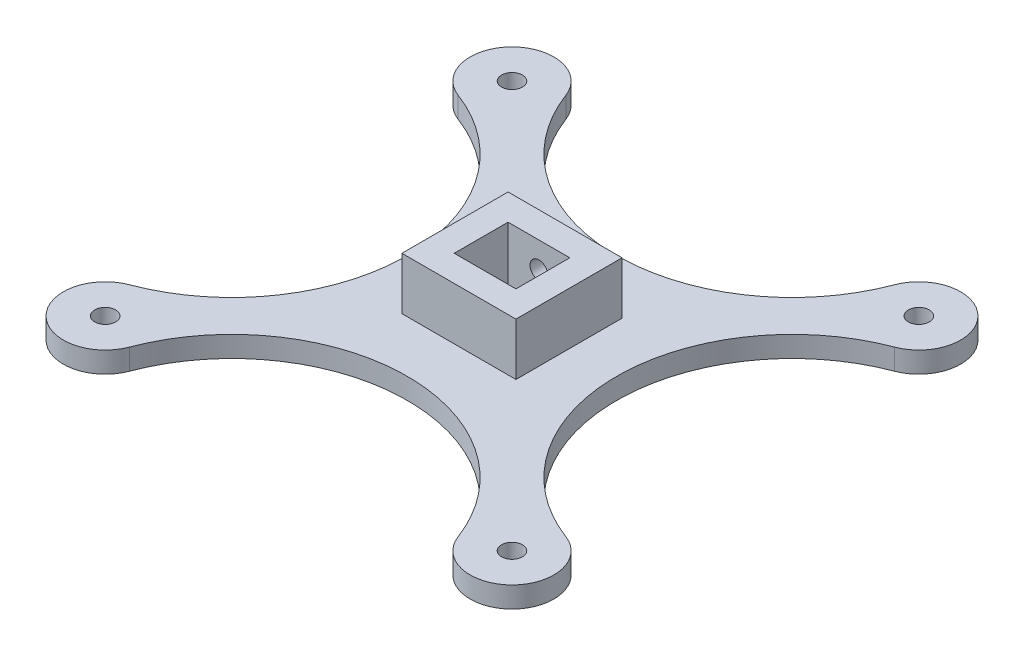
ISO-10303-21;
HEADER;
FILE_DESCRIPTION(('STEP AP214'),'2;1');
FILE_NAME('part.step','',(''),(''),'','','');
FILE_SCHEMA(('AUTOMOTIVE_DESIGN { 1 0 10303 214 1 1 1 1 }'));
ENDSEC;
DATA;
#1=APPLICATION_CONTEXT('core data for automotive mechanical design processes');
#2=APPLICATION_PROTOCOL_DEFINITION('international standard','automotive_design',2000,#1);
#3=PRODUCT_CONTEXT('',#1,'mechanical');
#4=PRODUCT('Part','Part','',(#3));
#5=PRODUCT_RELATED_PRODUCT_CATEGORY('part','',(#4));
#6=PRODUCT_DEFINITION_FORMATION('','',#4);
#7=PRODUCT_DEFINITION_CONTEXT('part definition',#1,'design');
#8=PRODUCT_DEFINITION('design','',#6,#7);
#9=PRODUCT_DEFINITION_SHAPE('','',#8);
#10=(LENGTH_UNIT() NAMED_UNIT(*) SI_UNIT(.MILLI.,.METRE.));
#11=(NAMED_UNIT(*) PLANE_ANGLE_UNIT() SI_UNIT($,.RADIAN.));
#12=(NAMED_UNIT(*) SI_UNIT($,.STERADIAN.) SOLID_ANGLE_UNIT());
#13=UNCERTAINTY_MEASURE_WITH_UNIT(LENGTH_MEASURE(1.E-05),#10,'distance_accuracy_value','');
#14=(GEOMETRIC_REPRESENTATION_CONTEXT(3) GLOBAL_UNCERTAINTY_ASSIGNED_CONTEXT((#13)) GLOBAL_UNIT_ASSIGNED_CONTEXT((#10,
#11,#12)) REPRESENTATION_CONTEXT('',''));
#15=CARTESIAN_POINT('',(0.,0.,0.));
#16=DIRECTION('',(0.,0.,1.));
#17=DIRECTION('',(1.,0.,0.));
#18=AXIS2_PLACEMENT_3D('',#15,#16,#17);
#19=CARTESIAN_POINT('',(-46.2296171572582,4.,19.44543648263));
#20=DIRECTION('',(0.,-1.,0.));
#21=DIRECTION('',(0.,0.,-1.));
#22=AXIS2_PLACEMENT_3D('',#19,#20,#21);
#23=PLANE('',#22);
#24=DIRECTION('',(-1.,0.,0.));
#25=VECTOR('',#24,1.);
#26=CARTESIAN_POINT('',(-10.9,4.,10.15));
#27=LINE('',#26,#25);
#28=CARTESIAN_POINT('',(10.9,4.,10.15));
#29=VERTEX_POINT('',#28);
#30=CARTESIAN_POINT('',(-10.9,4.,10.15));
#31=VERTEX_POINT('',#30);
#32=EDGE_CURVE('E320',#29,#31,#27,.T.);
#33=ORIENTED_EDGE('',*,*,#32,.T.);
#34=DIRECTION('',(0.,0.,-1.));
#35=VECTOR('',#34,1.);
#36=CARTESIAN_POINT('',(-10.9,4.,-10.15));
#37=LINE('',#36,#35);
#38=CARTESIAN_POINT('',(-10.9,4.,-10.15));
#39=VERTEX_POINT('',#38);
#40=EDGE_CURVE('E331',#31,#39,#37,.T.);
#41=ORIENTED_EDGE('',*,*,#40,.T.);
#42=DIRECTION('',(1.,0.,0.));
#43=VECTOR('',#42,1.);
#44=CARTESIAN_POINT('',(-10.9,4.,-10.15));
#45=LINE('',#44,#43);
#46=CARTESIAN_POINT('',(10.9,4.,-10.15));
#47=VERTEX_POINT('',#46);
#48=EDGE_CURVE('E327',#39,#47,#45,.T.);
#49=ORIENTED_EDGE('',*,*,#48,.T.);
#50=DIRECTION('',(0.,0.,1.));
#51=VECTOR('',#50,1.);
#52=CARTESIAN_POINT('',(10.9,4.,-10.15));
#53=LINE('',#52,#51);
#54=EDGE_CURVE('E75',#47,#29,#53,.T.);
#55=ORIENTED_EDGE('',*,*,#54,.T.);
#56=EDGE_LOOP('',(#33,#41,#49,#55));
#57=FACE_BOUND('',#56,.T.);
#58=CARTESIAN_POINT('',(-53.5683613492563,4.,0.));
#59=DIRECTION('',(0.,-1.,0.));
#60=DIRECTION('',(0.,0.,-1.));
#61=AXIS2_PLACEMENT_3D('',#58,#59,#60);
#62=CIRCLE('',#61,33.5683613492563);
#63=CARTESIAN_POINT('',(-41.7156152274198,4.,-31.4061664812109));
#64=VERTEX_POINT('',#63);
#65=CARTESIAN_POINT('',(-41.7156152274198,4.,31.4061664812109));
#66=VERTEX_POINT('',#65);
#67=EDGE_CURVE('E229',#64,#66,#62,.T.);
#68=ORIENTED_EDGE('',*,*,#67,.T.);
#69=CARTESIAN_POINT('',(-38.8908729652601,4.,38.8908729652601));
#70=DIRECTION('',(0.,1.,0.));
#71=DIRECTION('',(0.,0.,1.));
#72=AXIS2_PLACEMENT_3D('',#69,#70,#71);
#73=CIRCLE('',#72,7.99999999999999);
#74=CARTESIAN_POINT('',(-31.4061664812109,4.,41.7156152274198));
#75=VERTEX_POINT('',#74);
#76=EDGE_CURVE('E270',#66,#75,#73,.T.);
#77=ORIENTED_EDGE('',*,*,#76,.T.);
#78=CARTESIAN_POINT('',(0.,4.,53.5683613492563));
#79=DIRECTION('',(0.,-1.,0.));
#80=DIRECTION('',(0.,0.,-1.));
#81=AXIS2_PLACEMENT_3D('',#78,#79,#80);
#82=CIRCLE('',#81,33.5683613492563);
#83=CARTESIAN_POINT('',(31.4061664812108,4.,41.7156152274198));
#84=VERTEX_POINT('',#83);
#85=EDGE_CURVE('E267',#75,#84,#82,.T.);
#86=ORIENTED_EDGE('',*,*,#85,.T.);
#87=CARTESIAN_POINT('',(38.8908729652601,4.,38.8908729652601));
#88=DIRECTION('',(0.,1.,0.));
#89=DIRECTION('',(0.,0.,1.));
#90=AXIS2_PLACEMENT_3D('',#87,#88,#89);
#91=CIRCLE('',#90,8.);
#92=CARTESIAN_POINT('',(41.7156152274198,4.,31.4061664812108));
#93=VERTEX_POINT('',#92);
#94=EDGE_CURVE('E264',#84,#93,#91,.T.);
#95=ORIENTED_EDGE('',*,*,#94,.T.);
#96=CARTESIAN_POINT('',(53.5683613492563,4.,0.));
#97=DIRECTION('',(0.,-1.,0.));
#98=DIRECTION('',(0.,0.,1.));
#99=AXIS2_PLACEMENT_3D('',#96,#97,#98);
#100=CIRCLE('',#99,33.5683613492563);
#101=CARTESIAN_POINT('',(41.7156152274198,4.,-31.4061664812109));
#102=VERTEX_POINT('',#101);
#103=EDGE_CURVE('E261',#93,#102,#100,.T.);
#104=ORIENTED_EDGE('',*,*,#103,.T.);
#105=CARTESIAN_POINT('',(38.8908729652601,4.,-38.8908729652601));
#106=DIRECTION('',(0.,1.,0.));
#107=DIRECTION('',(0.,0.,1.));
#108=AXIS2_PLACEMENT_3D('',#105,#106,#107);
#109=CIRCLE('',#108,8.00000000000001);
#110=CARTESIAN_POINT('',(31.4061664812109,4.,-41.7156152274198));
#111=VERTEX_POINT('',#110);
#112=EDGE_CURVE('E258',#102,#111,#109,.T.);
#113=ORIENTED_EDGE('',*,*,#112,.T.);
#114=CARTESIAN_POINT('',(0.,4.,-53.5683613492563));
#115=DIRECTION('',(0.,-1.,0.));
#116=DIRECTION('',(0.,0.,1.));
#117=AXIS2_PLACEMENT_3D('',#114,#115,#116);
#118=CIRCLE('',#117,33.5683613492563);
#119=CARTESIAN_POINT('',(-31.4061664812108,4.,-41.7156152274198));
#120=VERTEX_POINT('',#119);
#121=EDGE_CURVE('E255',#111,#120,#118,.T.);
#122=ORIENTED_EDGE('',*,*,#121,.T.);
#123=CARTESIAN_POINT('',(-38.8908729652601,4.,-38.8908729652601));
#124=DIRECTION('',(0.,1.,0.));
#125=DIRECTION('',(0.,0.,1.));
#126=AXIS2_PLACEMENT_3D('',#123,#124,#125);
#127=CIRCLE('',#126,8.);
#128=EDGE_CURVE('E225',#120,#64,#127,.T.);
#129=ORIENTED_EDGE('',*,*,#128,.T.);
#130=EDGE_LOOP('',(#68,#77,#86,#95,#104,#113,#122,#129));
#131=FACE_BOUND('',#130,.T.);
#132=CARTESIAN_POINT('',(-38.8908729652601,4.,-38.8908729652601));
#133=DIRECTION('',(0.,1.,0.));
#134=DIRECTION('',(0.,0.,1.));
#135=AXIS2_PLACEMENT_3D('',#132,#133,#134);
#136=CIRCLE('',#135,2.);
#137=CARTESIAN_POINT('',(-38.8908729652601,4.,-36.8908729652601));
#138=VERTEX_POINT('',#137);
#139=EDGE_CURVE('E252',#138,#138,#136,.T.);
#140=ORIENTED_EDGE('',*,*,#139,.F.);
#141=EDGE_LOOP('',(#140));
#142=FACE_BOUND('',#141,.T.);
#143=CARTESIAN_POINT('',(38.8908729652601,4.,-38.8908729652601));
#144=DIRECTION('',(0.,1.,0.));
#145=DIRECTION('',(0.,0.,1.));
#146=AXIS2_PLACEMENT_3D('',#143,#144,#145);
#147=CIRCLE('',#146,2.);
#148=CARTESIAN_POINT('',(38.8908729652601,4.,-36.8908729652601));
#149=VERTEX_POINT('',#148);
#150=EDGE_CURVE('E280',#149,#149,#147,.T.);
#151=ORIENTED_EDGE('',*,*,#150,.F.);
#152=EDGE_LOOP('',(#151));
#153=FACE_BOUND('',#152,.T.);
#154=CARTESIAN_POINT('',(38.8908729652601,4.,38.8908729652601));
#155=DIRECTION('',(0.,1.,0.));
#156=DIRECTION('',(0.,0.,1.));
#157=AXIS2_PLACEMENT_3D('',#154,#155,#156);
#158=CIRCLE('',#157,2.);
#159=CARTESIAN_POINT('',(38.8908729652601,4.,40.8908729652601));
#160=VERTEX_POINT('',#159);
#161=EDGE_CURVE('E288',#160,#160,#158,.T.);
#162=ORIENTED_EDGE('',*,*,#161,.F.);
#163=EDGE_LOOP('',(#162));
#164=FACE_BOUND('',#163,.T.);
#165=CARTESIAN_POINT('',(-38.8908729652601,4.,38.8908729652601));
#166=DIRECTION('',(0.,1.,0.));
#167=DIRECTION('',(0.,0.,1.));
#168=AXIS2_PLACEMENT_3D('',#165,#166,#167);
#169=CIRCLE('',#168,2.);
#170=CARTESIAN_POINT('',(-38.8908729652601,4.,40.8908729652601));
#171=VERTEX_POINT('',#170);
#172=EDGE_CURVE('E296',#171,#171,#169,.T.);
#173=ORIENTED_EDGE('',*,*,#172,.F.);
#174=EDGE_LOOP('',(#173));
#175=FACE_BOUND('',#174,.T.);
#176=ADVANCED_FACE('F51',(#57,#131,#142,#153,#164,#175),#23,.F.);
#177=CARTESIAN_POINT('',(-46.2296171572582,0.,19.44543648263));
#178=DIRECTION('',(0.,-1.,0.));
#179=DIRECTION('',(0.,0.,-1.));
#180=AXIS2_PLACEMENT_3D('',#177,#178,#179);
#181=PLANE('',#180);
#182=DIRECTION('',(0.,0.,-1.));
#183=VECTOR('',#182,1.);
#184=CARTESIAN_POINT('',(-5.9,0.,19.44543648263));
#185=LINE('',#184,#183);
#186=CARTESIAN_POINT('',(-5.9,0.,5.15));
#187=VERTEX_POINT('',#186);
#188=CARTESIAN_POINT('',(-5.9,0.,-5.15));
#189=VERTEX_POINT('',#188);
#190=EDGE_CURVE('E11',#187,#189,#185,.T.);
#191=ORIENTED_EDGE('',*,*,#190,.F.);
#192=DIRECTION('',(-1.,0.,0.));
#193=VECTOR('',#192,1.);
#194=CARTESIAN_POINT('',(-46.2296171572582,0.,5.15));
#195=LINE('',#194,#193);
#196=CARTESIAN_POINT('',(5.9,0.,5.15));
#197=VERTEX_POINT('',#196);
#198=EDGE_CURVE('E176',#197,#187,#195,.T.);
#199=ORIENTED_EDGE('',*,*,#198,.F.);
#200=DIRECTION('',(0.,0.,-1.));
#201=VECTOR('',#200,1.);
#202=CARTESIAN_POINT('',(5.9,0.,19.44543648263));
#203=LINE('',#202,#201);
#204=CARTESIAN_POINT('',(5.9,0.,-5.15));
#205=VERTEX_POINT('',#204);
#206=EDGE_CURVE('E181',#197,#205,#203,.T.);
#207=ORIENTED_EDGE('',*,*,#206,.T.);
#208=DIRECTION('',(-1.,0.,0.));
#209=VECTOR('',#208,1.);
#210=CARTESIAN_POINT('',(-46.2296171572582,0.,-5.15));
#211=LINE('',#210,#209);
#212=EDGE_CURVE('E60',#205,#189,#211,.T.);
#213=ORIENTED_EDGE('',*,*,#212,.T.);
#214=EDGE_LOOP('',(#191,#199,#207,#213));
#215=FACE_BOUND('',#214,.T.);
#216=CARTESIAN_POINT('',(38.8908729652601,0.,38.8908729652601));
#217=DIRECTION('',(0.,1.,0.));
#218=DIRECTION('',(0.,0.,1.));
#219=AXIS2_PLACEMENT_3D('',#216,#217,#218);
#220=CIRCLE('',#219,2.);
#221=CARTESIAN_POINT('',(38.8908729652601,0.,40.8908729652601));
#222=VERTEX_POINT('',#221);
#223=EDGE_CURVE('E292',#222,#222,#220,.T.);
#224=ORIENTED_EDGE('',*,*,#223,.T.);
#225=EDGE_LOOP('',(#224));
#226=FACE_BOUND('',#225,.T.);
#227=CARTESIAN_POINT('',(-38.8908729652601,0.,-38.8908729652601));
#228=DIRECTION('',(0.,1.,0.));
#229=DIRECTION('',(0.,0.,1.));
#230=AXIS2_PLACEMENT_3D('',#227,#228,#229);
#231=CIRCLE('',#230,2.);
#232=CARTESIAN_POINT('',(-38.8908729652601,0.,-36.8908729652601));
#233=VERTEX_POINT('',#232);
#234=EDGE_CURVE('E276',#233,#233,#231,.T.);
#235=ORIENTED_EDGE('',*,*,#234,.T.);
#236=EDGE_LOOP('',(#235));
#237=FACE_BOUND('',#236,.T.);
#238=CARTESIAN_POINT('',(-53.5683613492563,0.,0.));
#239=DIRECTION('',(0.,-1.,0.));
#240=DIRECTION('',(0.,0.,-1.));
#241=AXIS2_PLACEMENT_3D('',#238,#239,#240);
#242=CIRCLE('',#241,33.5683613492563);
#243=CARTESIAN_POINT('',(-41.7156152274198,0.,-31.4061664812109));
#244=VERTEX_POINT('',#243);
#245=CARTESIAN_POINT('',(-41.7156152274198,0.,31.4061664812109));
#246=VERTEX_POINT('',#245);
#247=EDGE_CURVE('E248',#244,#246,#242,.T.);
#248=ORIENTED_EDGE('',*,*,#247,.F.);
#249=CARTESIAN_POINT('',(-38.8908729652601,0.,-38.8908729652601));
#250=DIRECTION('',(0.,1.,0.));
#251=DIRECTION('',(0.,0.,1.));
#252=AXIS2_PLACEMENT_3D('',#249,#250,#251);
#253=CIRCLE('',#252,8.);
#254=CARTESIAN_POINT('',(-31.4061664812108,0.,-41.7156152274198));
#255=VERTEX_POINT('',#254);
#256=EDGE_CURVE('E226',#255,#244,#253,.T.);
#257=ORIENTED_EDGE('',*,*,#256,.F.);
#258=CARTESIAN_POINT('',(0.,0.,-53.5683613492563));
#259=DIRECTION('',(0.,-1.,0.));
#260=DIRECTION('',(0.,0.,1.));
#261=AXIS2_PLACEMENT_3D('',#258,#259,#260);
#262=CIRCLE('',#261,33.5683613492563);
#263=CARTESIAN_POINT('',(31.4061664812109,0.,-41.7156152274198));
#264=VERTEX_POINT('',#263);
#265=EDGE_CURVE('E230',#264,#255,#262,.T.);
#266=ORIENTED_EDGE('',*,*,#265,.F.);
#267=CARTESIAN_POINT('',(38.8908729652601,0.,-38.8908729652601));
#268=DIRECTION('',(0.,1.,0.));
#269=DIRECTION('',(0.,0.,1.));
#270=AXIS2_PLACEMENT_3D('',#267,#268,#269);
#271=CIRCLE('',#270,8.00000000000001);
#272=CARTESIAN_POINT('',(41.7156152274198,0.,-31.4061664812109));
#273=VERTEX_POINT('',#272);
#274=EDGE_CURVE('E233',#273,#264,#271,.T.);
#275=ORIENTED_EDGE('',*,*,#274,.F.);
#276=CARTESIAN_POINT('',(53.5683613492563,0.,0.));
#277=DIRECTION('',(0.,-1.,0.));
#278=DIRECTION('',(0.,0.,1.));
#279=AXIS2_PLACEMENT_3D('',#276,#277,#278);
#280=CIRCLE('',#279,33.5683613492563);
#281=CARTESIAN_POINT('',(41.7156152274198,0.,31.4061664812108));
#282=VERTEX_POINT('',#281);
#283=EDGE_CURVE('E236',#282,#273,#280,.T.);
#284=ORIENTED_EDGE('',*,*,#283,.F.);
#285=CARTESIAN_POINT('',(38.8908729652601,0.,38.8908729652601));
#286=DIRECTION('',(0.,1.,0.));
#287=DIRECTION('',(0.,0.,1.));
#288=AXIS2_PLACEMENT_3D('',#285,#286,#287);
#289=CIRCLE('',#288,8.);
#290=CARTESIAN_POINT('',(31.4061664812108,0.,41.7156152274198));
#291=VERTEX_POINT('',#290);
#292=EDGE_CURVE('E239',#291,#282,#289,.T.);
#293=ORIENTED_EDGE('',*,*,#292,.F.);
#294=CARTESIAN_POINT('',(0.,0.,53.5683613492563));
#295=DIRECTION('',(0.,-1.,0.));
#296=DIRECTION('',(0.,0.,-1.));
#297=AXIS2_PLACEMENT_3D('',#294,#295,#296);
#298=CIRCLE('',#297,33.5683613492563);
#299=CARTESIAN_POINT('',(-31.4061664812109,0.,41.7156152274198));
#300=VERTEX_POINT('',#299);
#301=EDGE_CURVE('E242',#300,#291,#298,.T.);
#302=ORIENTED_EDGE('',*,*,#301,.F.);
#303=CARTESIAN_POINT('',(-38.8908729652601,0.,38.8908729652601));
#304=DIRECTION('',(0.,1.,0.));
#305=DIRECTION('',(0.,0.,1.));
#306=AXIS2_PLACEMENT_3D('',#303,#304,#305);
#307=CIRCLE('',#306,7.99999999999999);
#308=EDGE_CURVE('E245',#246,#300,#307,.T.);
#309=ORIENTED_EDGE('',*,*,#308,.F.);
#310=EDGE_LOOP('',(#248,#257,#266,#275,#284,#293,#302,#309));
#311=FACE_BOUND('',#310,.T.);
#312=CARTESIAN_POINT('',(38.8908729652601,0.,-38.8908729652601));
#313=DIRECTION('',(0.,1.,0.));
#314=DIRECTION('',(0.,0.,1.));
#315=AXIS2_PLACEMENT_3D('',#312,#313,#314);
#316=CIRCLE('',#315,2.);
#317=CARTESIAN_POINT('',(38.8908729652601,0.,-36.8908729652601));
#318=VERTEX_POINT('',#317);
#319=EDGE_CURVE('E284',#318,#318,#316,.T.);
#320=ORIENTED_EDGE('',*,*,#319,.T.);
#321=EDGE_LOOP('',(#320));
#322=FACE_BOUND('',#321,.T.);
#323=CARTESIAN_POINT('',(-38.8908729652601,0.,38.8908729652601));
#324=DIRECTION('',(0.,1.,0.));
#325=DIRECTION('',(0.,0.,1.));
#326=AXIS2_PLACEMENT_3D('',#323,#324,#325);
#327=CIRCLE('',#326,2.);
#328=CARTESIAN_POINT('',(-38.8908729652601,0.,40.8908729652601));
#329=VERTEX_POINT('',#328);
#330=EDGE_CURVE('E300',#329,#329,#327,.T.);
#331=ORIENTED_EDGE('',*,*,#330,.T.);
#332=EDGE_LOOP('',(#331));
#333=FACE_BOUND('',#332,.T.);
#334=ADVANCED_FACE('F184',(#215,#226,#237,#311,#322,#333),#181,.T.);
#335=CARTESIAN_POINT('',(-53.5683613492563,4.,0.));
#336=DIRECTION('',(0.,-1.,0.));
#337=DIRECTION('',(0.,0.,-1.));
#338=AXIS2_PLACEMENT_3D('',#335,#336,#337);
#339=CYLINDRICAL_SURFACE('',#338,33.5683613492563);
#340=ORIENTED_EDGE('',*,*,#247,.T.);
#341=DIRECTION('',(0.,-1.,0.));
#342=VECTOR('',#341,1.);
#343=CARTESIAN_POINT('',(-41.7156152274198,4.,31.4061664812109));
#344=LINE('',#343,#342);
#345=EDGE_CURVE('E182',#66,#246,#344,.T.);
#346=ORIENTED_EDGE('',*,*,#345,.F.);
#347=ORIENTED_EDGE('',*,*,#67,.F.);
#348=DIRECTION('',(0.,-1.,0.));
#349=VECTOR('',#348,1.);
#350=CARTESIAN_POINT('',(-41.7156152274198,4.,-31.4061664812109));
#351=LINE('',#350,#349);
#352=EDGE_CURVE('E221',#64,#244,#351,.T.);
#353=ORIENTED_EDGE('',*,*,#352,.T.);
#354=EDGE_LOOP('',(#340,#346,#347,#353));
#355=FACE_BOUND('',#354,.T.);
#356=ADVANCED_FACE('F53',(#355),#339,.F.);
#357=CARTESIAN_POINT('',(-38.8908729652601,4.,38.8908729652601));
#358=DIRECTION('',(0.,-1.,0.));
#359=DIRECTION('',(0.,0.,-1.));
#360=AXIS2_PLACEMENT_3D('',#357,#358,#359);
#361=CYLINDRICAL_SURFACE('',#360,7.99999999999999);
#362=ORIENTED_EDGE('',*,*,#308,.T.);
#363=DIRECTION('',(0.,-1.,0.));
#364=VECTOR('',#363,1.);
#365=CARTESIAN_POINT('',(-31.4061664812109,4.,41.7156152274198));
#366=LINE('',#365,#364);
#367=EDGE_CURVE('E197',#75,#300,#366,.T.);
#368=ORIENTED_EDGE('',*,*,#367,.F.);
#369=ORIENTED_EDGE('',*,*,#76,.F.);
#370=ORIENTED_EDGE('',*,*,#345,.T.);
#371=EDGE_LOOP('',(#362,#368,#369,#370));
#372=FACE_BOUND('',#371,.T.);
#373=ADVANCED_FACE('F438',(#372),#361,.T.);
#374=CARTESIAN_POINT('',(0.,4.,53.5683613492563));
#375=DIRECTION('',(0.,-1.,0.));
#376=DIRECTION('',(0.,0.,-1.));
#377=AXIS2_PLACEMENT_3D('',#374,#375,#376);
#378=CYLINDRICAL_SURFACE('',#377,33.5683613492563);
#379=ORIENTED_EDGE('',*,*,#301,.T.);
#380=DIRECTION('',(0.,-1.,0.));
#381=VECTOR('',#380,1.);
#382=CARTESIAN_POINT('',(31.4061664812108,4.,41.7156152274198));
#383=LINE('',#382,#381);
#384=EDGE_CURVE('E201',#84,#291,#383,.T.);
#385=ORIENTED_EDGE('',*,*,#384,.F.);
#386=ORIENTED_EDGE('',*,*,#85,.F.);
#387=ORIENTED_EDGE('',*,*,#367,.T.);
#388=EDGE_LOOP('',(#379,#385,#386,#387));
#389=FACE_BOUND('',#388,.T.);
#390=ADVANCED_FACE('F435',(#389),#378,.F.);
#391=CARTESIAN_POINT('',(38.8908729652601,4.,38.8908729652601));
#392=DIRECTION('',(0.,-1.,0.));
#393=DIRECTION('',(0.,0.,-1.));
#394=AXIS2_PLACEMENT_3D('',#391,#392,#393);
#395=CYLINDRICAL_SURFACE('',#394,8.);
#396=ORIENTED_EDGE('',*,*,#292,.T.);
#397=DIRECTION('',(0.,-1.,0.));
#398=VECTOR('',#397,1.);
#399=CARTESIAN_POINT('',(41.7156152274198,4.,31.4061664812108));
#400=LINE('',#399,#398);
#401=EDGE_CURVE('E205',#93,#282,#400,.T.);
#402=ORIENTED_EDGE('',*,*,#401,.F.);
#403=ORIENTED_EDGE('',*,*,#94,.F.);
#404=ORIENTED_EDGE('',*,*,#384,.T.);
#405=EDGE_LOOP('',(#396,#402,#403,#404));
#406=FACE_BOUND('',#405,.T.);
#407=ADVANCED_FACE('F431',(#406),#395,.T.);
#408=CARTESIAN_POINT('',(53.5683613492563,4.,0.));
#409=DIRECTION('',(0.,-1.,0.));
#410=DIRECTION('',(0.,0.,-1.));
#411=AXIS2_PLACEMENT_3D('',#408,#409,#410);
#412=CYLINDRICAL_SURFACE('',#411,33.5683613492563);
#413=ORIENTED_EDGE('',*,*,#283,.T.);
#414=DIRECTION('',(0.,-1.,0.));
#415=VECTOR('',#414,1.);
#416=CARTESIAN_POINT('',(41.7156152274198,4.,-31.4061664812109));
#417=LINE('',#416,#415);
#418=EDGE_CURVE('E209',#102,#273,#417,.T.);
#419=ORIENTED_EDGE('',*,*,#418,.F.);
#420=ORIENTED_EDGE('',*,*,#103,.F.);
#421=ORIENTED_EDGE('',*,*,#401,.T.);
#422=EDGE_LOOP('',(#413,#419,#420,#421));
#423=FACE_BOUND('',#422,.T.);
#424=ADVANCED_FACE('F427',(#423),#412,.F.);
#425=CARTESIAN_POINT('',(38.8908729652601,4.,-38.8908729652601));
#426=DIRECTION('',(0.,-1.,0.));
#427=DIRECTION('',(0.,0.,-1.));
#428=AXIS2_PLACEMENT_3D('',#425,#426,#427);
#429=CYLINDRICAL_SURFACE('',#428,8.00000000000001);
#430=ORIENTED_EDGE('',*,*,#274,.T.);
#431=DIRECTION('',(0.,-1.,0.));
#432=VECTOR('',#431,1.);
#433=CARTESIAN_POINT('',(31.4061664812109,4.,-41.7156152274198));
#434=LINE('',#433,#432);
#435=EDGE_CURVE('E213',#111,#264,#434,.T.);
#436=ORIENTED_EDGE('',*,*,#435,.F.);
#437=ORIENTED_EDGE('',*,*,#112,.F.);
#438=ORIENTED_EDGE('',*,*,#418,.T.);
#439=EDGE_LOOP('',(#430,#436,#437,#438));
#440=FACE_BOUND('',#439,.T.);
#441=ADVANCED_FACE('F423',(#440),#429,.T.);
#442=CARTESIAN_POINT('',(0.,4.,-53.5683613492563));
#443=DIRECTION('',(0.,-1.,0.));
#444=DIRECTION('',(0.,0.,-1.));
#445=AXIS2_PLACEMENT_3D('',#442,#443,#444);
#446=CYLINDRICAL_SURFACE('',#445,33.5683613492563);
#447=ORIENTED_EDGE('',*,*,#265,.T.);
#448=DIRECTION('',(0.,-1.,0.));
#449=VECTOR('',#448,1.);
#450=CARTESIAN_POINT('',(-31.4061664812108,4.,-41.7156152274198));
#451=LINE('',#450,#449);
#452=EDGE_CURVE('E217',#120,#255,#451,.T.);
#453=ORIENTED_EDGE('',*,*,#452,.F.);
#454=ORIENTED_EDGE('',*,*,#121,.F.);
#455=ORIENTED_EDGE('',*,*,#435,.T.);
#456=EDGE_LOOP('',(#447,#453,#454,#455));
#457=FACE_BOUND('',#456,.T.);
#458=ADVANCED_FACE('F419',(#457),#446,.F.);
#459=CARTESIAN_POINT('',(-38.8908729652601,4.,-38.8908729652601));
#460=DIRECTION('',(0.,-1.,0.));
#461=DIRECTION('',(0.,0.,-1.));
#462=AXIS2_PLACEMENT_3D('',#459,#460,#461);
#463=CYLINDRICAL_SURFACE('',#462,8.);
#464=ORIENTED_EDGE('',*,*,#256,.T.);
#465=ORIENTED_EDGE('',*,*,#352,.F.);
#466=ORIENTED_EDGE('',*,*,#128,.F.);
#467=ORIENTED_EDGE('',*,*,#452,.T.);
#468=EDGE_LOOP('',(#464,#465,#466,#467));
#469=FACE_BOUND('',#468,.T.);
#470=ADVANCED_FACE('F416',(#469),#463,.T.);
#471=CARTESIAN_POINT('',(-38.8908729652601,4.,-38.8908729652601));
#472=DIRECTION('',(0.,-1.,0.));
#473=DIRECTION('',(0.,0.,-1.));
#474=AXIS2_PLACEMENT_3D('',#471,#472,#473);
#475=CYLINDRICAL_SURFACE('',#474,2.);
#476=ORIENTED_EDGE('',*,*,#139,.T.);
#477=EDGE_LOOP('',(#476));
#478=FACE_BOUND('',#477,.T.);
#479=ORIENTED_EDGE('',*,*,#234,.F.);
#480=EDGE_LOOP('',(#479));
#481=FACE_BOUND('',#480,.T.);
#482=ADVANCED_FACE('F413',(#478,#481),#475,.F.);
#483=CARTESIAN_POINT('',(38.8908729652601,4.,-38.8908729652601));
#484=DIRECTION('',(0.,-1.,0.));
#485=DIRECTION('',(0.,0.,-1.));
#486=AXIS2_PLACEMENT_3D('',#483,#484,#485);
#487=CYLINDRICAL_SURFACE('',#486,2.);
#488=ORIENTED_EDGE('',*,*,#150,.T.);
#489=EDGE_LOOP('',(#488));
#490=FACE_BOUND('',#489,.T.);
#491=ORIENTED_EDGE('',*,*,#319,.F.);
#492=EDGE_LOOP('',(#491));
#493=FACE_BOUND('',#492,.T.);
#494=ADVANCED_FACE('F489',(#490,#493),#487,.F.);
#495=CARTESIAN_POINT('',(38.8908729652601,4.,38.8908729652601));
#496=DIRECTION('',(0.,-1.,0.));
#497=DIRECTION('',(0.,0.,-1.));
#498=AXIS2_PLACEMENT_3D('',#495,#496,#497);
#499=CYLINDRICAL_SURFACE('',#498,2.);
#500=ORIENTED_EDGE('',*,*,#161,.T.);
#501=EDGE_LOOP('',(#500));
#502=FACE_BOUND('',#501,.T.);
#503=ORIENTED_EDGE('',*,*,#223,.F.);
#504=EDGE_LOOP('',(#503));
#505=FACE_BOUND('',#504,.T.);
#506=ADVANCED_FACE('F481',(#502,#505),#499,.F.);
#507=CARTESIAN_POINT('',(-38.8908729652601,4.,38.8908729652601));
#508=DIRECTION('',(0.,-1.,0.));
#509=DIRECTION('',(0.,0.,-1.));
#510=AXIS2_PLACEMENT_3D('',#507,#508,#509);
#511=CYLINDRICAL_SURFACE('',#510,2.);
#512=ORIENTED_EDGE('',*,*,#172,.T.);
#513=EDGE_LOOP('',(#512));
#514=FACE_BOUND('',#513,.T.);
#515=ORIENTED_EDGE('',*,*,#330,.F.);
#516=EDGE_LOOP('',(#515));
#517=FACE_BOUND('',#516,.T.);
#518=ADVANCED_FACE('F478',(#514,#517),#511,.F.);
#519=CARTESIAN_POINT('',(-10.9,14.,-10.15));
#520=DIRECTION('',(-1.,0.,0.));
#521=DIRECTION('',(0.,0.,1.));
#522=AXIS2_PLACEMENT_3D('',#519,#520,#521);
#523=PLANE('',#522);
#524=ORIENTED_EDGE('',*,*,#40,.F.);
#525=DIRECTION('',(0.,-1.,0.));
#526=VECTOR('',#525,1.);
#527=CARTESIAN_POINT('',(-10.9,14.,10.15));
#528=LINE('',#527,#526);
#529=CARTESIAN_POINT('',(-10.9,14.,10.15));
#530=VERTEX_POINT('',#529);
#531=EDGE_CURVE('E304',#530,#31,#528,.T.);
#532=ORIENTED_EDGE('',*,*,#531,.F.);
#533=DIRECTION('',(0.,0.,-1.));
#534=VECTOR('',#533,1.);
#535=CARTESIAN_POINT('',(-10.9,14.,-10.15));
#536=LINE('',#535,#534);
#537=CARTESIAN_POINT('',(-10.9,14.,-10.15));
#538=VERTEX_POINT('',#537);
#539=EDGE_CURVE('E324',#530,#538,#536,.T.);
#540=ORIENTED_EDGE('',*,*,#539,.T.);
#541=DIRECTION('',(0.,-1.,0.));
#542=VECTOR('',#541,1.);
#543=CARTESIAN_POINT('',(-10.9,14.,-10.15));
#544=LINE('',#543,#542);
#545=EDGE_CURVE('E308',#538,#39,#544,.T.);
#546=ORIENTED_EDGE('',*,*,#545,.T.);
#547=EDGE_LOOP('',(#524,#532,#540,#546));
#548=FACE_BOUND('',#547,.T.);
#549=ADVANCED_FACE('F395',(#548),#523,.T.);
#550=CARTESIAN_POINT('',(-10.9,14.,10.15));
#551=DIRECTION('',(0.,0.,1.));
#552=DIRECTION('',(1.,0.,0.));
#553=AXIS2_PLACEMENT_3D('',#550,#551,#552);
#554=PLANE('',#553);
#555=ORIENTED_EDGE('',*,*,#32,.F.);
#556=DIRECTION('',(0.,-1.,0.));
#557=VECTOR('',#556,1.);
#558=CARTESIAN_POINT('',(10.9,14.,10.15));
#559=LINE('',#558,#557);
#560=CARTESIAN_POINT('',(10.9,14.,10.15));
#561=VERTEX_POINT('',#560);
#562=EDGE_CURVE('E315',#561,#29,#559,.T.);
#563=ORIENTED_EDGE('',*,*,#562,.F.);
#564=DIRECTION('',(-1.,0.,0.));
#565=VECTOR('',#564,1.);
#566=CARTESIAN_POINT('',(-10.9,14.,10.15));
#567=LINE('',#566,#565);
#568=EDGE_CURVE('E312',#561,#530,#567,.T.);
#569=ORIENTED_EDGE('',*,*,#568,.T.);
#570=ORIENTED_EDGE('',*,*,#531,.T.);
#571=EDGE_LOOP('',(#555,#563,#569,#570));
#572=FACE_BOUND('',#571,.T.);
#573=ADVANCED_FACE('F401',(#572),#554,.T.);
#574=CARTESIAN_POINT('',(10.9,14.,-10.15));
#575=DIRECTION('',(1.,0.,0.));
#576=DIRECTION('',(0.,0.,-1.));
#577=AXIS2_PLACEMENT_3D('',#574,#575,#576);
#578=PLANE('',#577);
#579=ORIENTED_EDGE('',*,*,#54,.F.);
#580=DIRECTION('',(0.,-1.,0.));
#581=VECTOR('',#580,1.);
#582=CARTESIAN_POINT('',(10.9,14.,-10.15));
#583=LINE('',#582,#581);
#584=CARTESIAN_POINT('',(10.9,14.,-10.15));
#585=VERTEX_POINT('',#584);
#586=EDGE_CURVE('E311',#585,#47,#583,.T.);
#587=ORIENTED_EDGE('',*,*,#586,.F.);
#588=DIRECTION('',(0.,0.,1.));
#589=VECTOR('',#588,1.);
#590=CARTESIAN_POINT('',(10.9,14.,-10.15));
#591=LINE('',#590,#589);
#592=EDGE_CURVE('E339',#585,#561,#591,.T.);
#593=ORIENTED_EDGE('',*,*,#592,.T.);
#594=ORIENTED_EDGE('',*,*,#562,.T.);
#595=EDGE_LOOP('',(#579,#587,#593,#594));
#596=FACE_BOUND('',#595,.T.);
#597=ADVANCED_FACE('F386',(#596),#578,.T.);
#598=CARTESIAN_POINT('',(-10.9,14.,-10.15));
#599=DIRECTION('',(0.,0.,-1.));
#600=DIRECTION('',(-1.,0.,0.));
#601=AXIS2_PLACEMENT_3D('',#598,#599,#600);
#602=PLANE('',#601);
#603=CARTESIAN_POINT('',(0.,9.,-10.15));
#604=DIRECTION('',(0.,0.,-1.));
#605=DIRECTION('',(-1.,0.,0.));
#606=AXIS2_PLACEMENT_3D('',#603,#604,#605);
#607=CIRCLE('',#606,1.7);
#608=CARTESIAN_POINT('',(-1.7,9.,-10.15));
#609=VERTEX_POINT('',#608);
#610=EDGE_CURVE('E373',#609,#609,#607,.T.);
#611=ORIENTED_EDGE('',*,*,#610,.F.);
#612=EDGE_LOOP('',(#611));
#613=FACE_BOUND('',#612,.T.);
#614=ORIENTED_EDGE('',*,*,#48,.F.);
#615=ORIENTED_EDGE('',*,*,#545,.F.);
#616=DIRECTION('',(1.,0.,0.));
#617=VECTOR('',#616,1.);
#618=CARTESIAN_POINT('',(-10.9,14.,-10.15));
#619=LINE('',#618,#617);
#620=EDGE_CURVE('E343',#538,#585,#619,.T.);
#621=ORIENTED_EDGE('',*,*,#620,.T.);
#622=ORIENTED_EDGE('',*,*,#586,.T.);
#623=EDGE_LOOP('',(#614,#615,#621,#622));
#624=FACE_BOUND('',#623,.T.);
#625=ADVANCED_FACE('F382',(#613,#624),#602,.T.);
#626=CARTESIAN_POINT('',(0.,14.,0.));
#627=DIRECTION('',(0.,1.,0.));
#628=DIRECTION('',(0.,0.,1.));
#629=AXIS2_PLACEMENT_3D('',#626,#627,#628);
#630=PLANE('',#629);
#631=DIRECTION('',(0.,0.,1.));
#632=VECTOR('',#631,1.);
#633=CARTESIAN_POINT('',(5.9,14.,-5.15));
#634=LINE('',#633,#632);
#635=CARTESIAN_POINT('',(5.9,14.,-5.15));
#636=VERTEX_POINT('',#635);
#637=CARTESIAN_POINT('',(5.9,14.,5.15));
#638=VERTEX_POINT('',#637);
#639=EDGE_CURVE('E365',#636,#638,#634,.T.);
#640=ORIENTED_EDGE('',*,*,#639,.T.);
#641=DIRECTION('',(-1.,0.,0.));
#642=VECTOR('',#641,1.);
#643=CARTESIAN_POINT('',(-5.9,14.,5.15));
#644=LINE('',#643,#642);
#645=CARTESIAN_POINT('',(-5.9,14.,5.15));
#646=VERTEX_POINT('',#645);
#647=EDGE_CURVE('E362',#638,#646,#644,.T.);
#648=ORIENTED_EDGE('',*,*,#647,.T.);
#649=DIRECTION('',(0.,0.,-1.));
#650=VECTOR('',#649,1.);
#651=CARTESIAN_POINT('',(-5.9,14.,-5.15));
#652=LINE('',#651,#650);
#653=CARTESIAN_POINT('',(-5.9,14.,-5.15));
#654=VERTEX_POINT('',#653);
#655=EDGE_CURVE('E170',#646,#654,#652,.T.);
#656=ORIENTED_EDGE('',*,*,#655,.T.);
#657=DIRECTION('',(1.,0.,0.));
#658=VECTOR('',#657,1.);
#659=CARTESIAN_POINT('',(-5.9,14.,-5.15));
#660=LINE('',#659,#658);
#661=EDGE_CURVE('E351',#654,#636,#660,.T.);
#662=ORIENTED_EDGE('',*,*,#661,.T.);
#663=EDGE_LOOP('',(#640,#648,#656,#662));
#664=FACE_BOUND('',#663,.T.);
#665=ORIENTED_EDGE('',*,*,#539,.F.);
#666=ORIENTED_EDGE('',*,*,#568,.F.);
#667=ORIENTED_EDGE('',*,*,#592,.F.);
#668=ORIENTED_EDGE('',*,*,#620,.F.);
#669=EDGE_LOOP('',(#665,#666,#667,#668));
#670=FACE_BOUND('',#669,.T.);
#671=ADVANCED_FACE('F385',(#664,#670),#630,.T.);
#672=CARTESIAN_POINT('',(5.9,14.,-5.15));
#673=DIRECTION('',(1.,0.,0.));
#674=DIRECTION('',(0.,0.,-1.));
#675=AXIS2_PLACEMENT_3D('',#672,#673,#674);
#676=PLANE('',#675);
#677=DIRECTION('',(0.,-1.,0.));
#678=VECTOR('',#677,1.);
#679=CARTESIAN_POINT('',(5.9,14.,-5.15));
#680=LINE('',#679,#678);
#681=EDGE_CURVE('E335',#636,#205,#680,.T.);
#682=ORIENTED_EDGE('',*,*,#681,.T.);
#683=ORIENTED_EDGE('',*,*,#206,.F.);
#684=DIRECTION('',(0.,-1.,0.));
#685=VECTOR('',#684,1.);
#686=CARTESIAN_POINT('',(5.9,14.,5.15));
#687=LINE('',#686,#685);
#688=EDGE_CURVE('E67',#638,#197,#687,.T.);
#689=ORIENTED_EDGE('',*,*,#688,.F.);
#690=ORIENTED_EDGE('',*,*,#639,.F.);
#691=EDGE_LOOP('',(#682,#683,#689,#690));
#692=FACE_BOUND('',#691,.T.);
#693=ADVANCED_FACE('F550',(#692),#676,.F.);
#694=CARTESIAN_POINT('',(-5.9,14.,-5.15));
#695=DIRECTION('',(0.,0.,-1.));
#696=DIRECTION('',(-1.,0.,0.));
#697=AXIS2_PLACEMENT_3D('',#694,#695,#696);
#698=PLANE('',#697);
#699=CARTESIAN_POINT('',(0.,9.,-5.15));
#700=DIRECTION('',(0.,0.,-1.));
#701=DIRECTION('',(-1.,0.,0.));
#702=AXIS2_PLACEMENT_3D('',#699,#700,#701);
#703=CIRCLE('',#702,1.7);
#704=CARTESIAN_POINT('',(-1.7,9.,-5.15));
#705=VERTEX_POINT('',#704);
#706=EDGE_CURVE('E369',#705,#705,#703,.T.);
#707=ORIENTED_EDGE('',*,*,#706,.T.);
#708=EDGE_LOOP('',(#707));
#709=FACE_BOUND('',#708,.T.);
#710=DIRECTION('',(0.,-1.,0.));
#711=VECTOR('',#710,1.);
#712=CARTESIAN_POINT('',(-5.9,14.,-5.15));
#713=LINE('',#712,#711);
#714=EDGE_CURVE('E173',#654,#189,#713,.T.);
#715=ORIENTED_EDGE('',*,*,#714,.T.);
#716=ORIENTED_EDGE('',*,*,#212,.F.);
#717=ORIENTED_EDGE('',*,*,#681,.F.);
#718=ORIENTED_EDGE('',*,*,#661,.F.);
#719=EDGE_LOOP('',(#715,#716,#717,#718));
#720=FACE_BOUND('',#719,.T.);
#721=ADVANCED_FACE('F555',(#709,#720),#698,.F.);
#722=CARTESIAN_POINT('',(-5.9,14.,-5.15));
#723=DIRECTION('',(-1.,0.,0.));
#724=DIRECTION('',(0.,0.,1.));
#725=AXIS2_PLACEMENT_3D('',#722,#723,#724);
#726=PLANE('',#725);
#727=DIRECTION('',(0.,-1.,0.));
#728=VECTOR('',#727,1.);
#729=CARTESIAN_POINT('',(-5.9,14.,5.15));
#730=LINE('',#729,#728);
#731=EDGE_CURVE('E165',#646,#187,#730,.T.);
#732=ORIENTED_EDGE('',*,*,#731,.T.);
#733=ORIENTED_EDGE('',*,*,#190,.T.);
#734=ORIENTED_EDGE('',*,*,#714,.F.);
#735=ORIENTED_EDGE('',*,*,#655,.F.);
#736=EDGE_LOOP('',(#732,#733,#734,#735));
#737=FACE_BOUND('',#736,.T.);
#738=ADVANCED_FACE('F166',(#737),#726,.F.);
#739=CARTESIAN_POINT('',(-5.9,14.,5.15));
#740=DIRECTION('',(0.,0.,1.));
#741=DIRECTION('',(1.,0.,0.));
#742=AXIS2_PLACEMENT_3D('',#739,#740,#741);
#743=PLANE('',#742);
#744=ORIENTED_EDGE('',*,*,#688,.T.);
#745=ORIENTED_EDGE('',*,*,#198,.T.);
#746=ORIENTED_EDGE('',*,*,#731,.F.);
#747=ORIENTED_EDGE('',*,*,#647,.F.);
#748=EDGE_LOOP('',(#744,#745,#746,#747));
#749=FACE_BOUND('',#748,.T.);
#750=ADVANCED_FACE('F177',(#749),#743,.F.);
#751=CARTESIAN_POINT('',(0.,9.,-10.15));
#752=DIRECTION('',(0.,0.,-1.));
#753=DIRECTION('',(-1.,0.,0.));
#754=AXIS2_PLACEMENT_3D('',#751,#752,#753);
#755=CYLINDRICAL_SURFACE('',#754,1.7);
#756=ORIENTED_EDGE('',*,*,#706,.F.);
#757=EDGE_LOOP('',(#756));
#758=FACE_BOUND('',#757,.T.);
#759=ORIENTED_EDGE('',*,*,#610,.T.);
#760=EDGE_LOOP('',(#759));
#761=FACE_BOUND('',#760,.T.);
#762=ADVANCED_FACE('F380',(#758,#761),#755,.F.);
#763=CLOSED_SHELL('',(#176,#334,#356,#373,#390,#407,#424,#441,#458,#470,#482,#494,#506,#518,
#549,#573,#597,#625,#671,#693,#721,#738,#750,#762));
#764=MANIFOLD_SOLID_BREP('B2',#763);
#765=ADVANCED_BREP_SHAPE_REPRESENTATION('',(#18,#764),#14);
#766=SHAPE_DEFINITION_REPRESENTATION(#9,#765);
ENDSEC;
END-ISO-10303-21;
